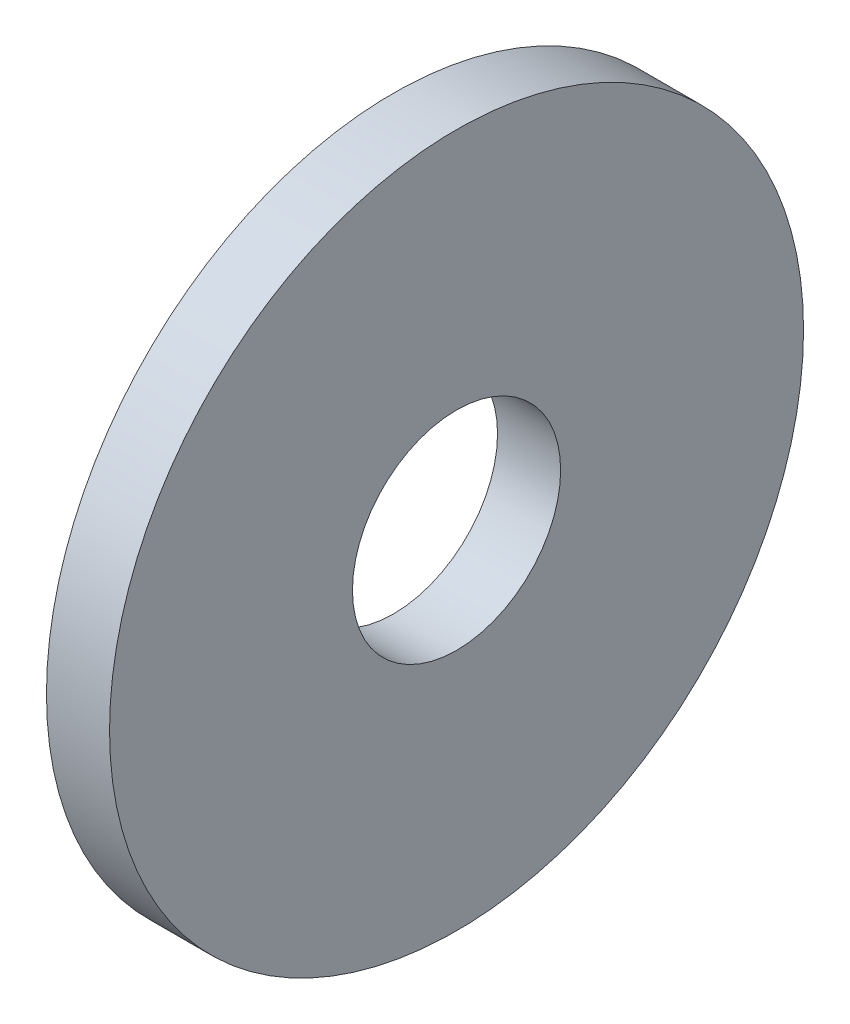
ISO-10303-21;
HEADER;
FILE_DESCRIPTION(('STEP AP214'),'2;1');
FILE_NAME('part.step','',(''),(''),'','','');
FILE_SCHEMA(('AUTOMOTIVE_DESIGN { 1 0 10303 214 1 1 1 1 }'));
ENDSEC;
DATA;
#1=APPLICATION_CONTEXT('core data for automotive mechanical design processes');
#2=APPLICATION_PROTOCOL_DEFINITION('international standard','automotive_design',2000,#1);
#3=PRODUCT_CONTEXT('',#1,'mechanical');
#4=PRODUCT('Part','Part','',(#3));
#5=PRODUCT_RELATED_PRODUCT_CATEGORY('part','',(#4));
#6=PRODUCT_DEFINITION_FORMATION('','',#4);
#7=PRODUCT_DEFINITION_CONTEXT('part definition',#1,'design');
#8=PRODUCT_DEFINITION('design','',#6,#7);
#9=PRODUCT_DEFINITION_SHAPE('','',#8);
#10=(LENGTH_UNIT() NAMED_UNIT(*) SI_UNIT(.MILLI.,.METRE.));
#11=(NAMED_UNIT(*) PLANE_ANGLE_UNIT() SI_UNIT($,.RADIAN.));
#12=(NAMED_UNIT(*) SI_UNIT($,.STERADIAN.) SOLID_ANGLE_UNIT());
#13=UNCERTAINTY_MEASURE_WITH_UNIT(LENGTH_MEASURE(1.E-05),#10,'distance_accuracy_value','');
#14=(GEOMETRIC_REPRESENTATION_CONTEXT(3) GLOBAL_UNCERTAINTY_ASSIGNED_CONTEXT((#13)) GLOBAL_UNIT_ASSIGNED_CONTEXT((#10,
#11,#12)) REPRESENTATION_CONTEXT('',''));
#15=CARTESIAN_POINT('',(0.,0.,0.));
#16=DIRECTION('',(0.,0.,1.));
#17=DIRECTION('',(1.,0.,0.));
#18=AXIS2_PLACEMENT_3D('',#15,#16,#17);
#19=CARTESIAN_POINT('',(-34.9249999999999,0.,0.));
#20=DIRECTION('',(-1.,0.,0.));
#21=DIRECTION('',(0.,0.,1.));
#22=AXIS2_PLACEMENT_3D('',#19,#20,#21);
#23=CYLINDRICAL_SURFACE('',#22,3.3);
#24=CARTESIAN_POINT('',(0.,0.,0.));
#25=DIRECTION('',(-1.,0.,0.));
#26=DIRECTION('',(0.,0.,1.));
#27=AXIS2_PLACEMENT_3D('',#24,#25,#26);
#28=CIRCLE('',#27,3.3);
#29=CARTESIAN_POINT('',(0.,0.,3.3));
#30=VERTEX_POINT('',#29);
#31=EDGE_CURVE('E10',#30,#30,#28,.T.);
#32=ORIENTED_EDGE('',*,*,#31,.F.);
#33=EDGE_LOOP('',(#32));
#34=FACE_BOUND('',#33,.T.);
#35=CARTESIAN_POINT('',(-2.,0.,0.));
#36=DIRECTION('',(-1.,0.,0.));
#37=DIRECTION('',(0.,0.,1.));
#38=AXIS2_PLACEMENT_3D('',#35,#36,#37);
#39=CIRCLE('',#38,3.3);
#40=CARTESIAN_POINT('',(-2.,0.,3.3));
#41=VERTEX_POINT('',#40);
#42=EDGE_CURVE('E46',#41,#41,#39,.T.);
#43=ORIENTED_EDGE('',*,*,#42,.T.);
#44=EDGE_LOOP('',(#43));
#45=FACE_BOUND('',#44,.T.);
#46=ADVANCED_FACE('F32',(#34,#45),#23,.F.);
#47=CARTESIAN_POINT('',(0.,3.3,0.));
#48=DIRECTION('',(-1.,0.,0.));
#49=DIRECTION('',(0.,0.,1.));
#50=AXIS2_PLACEMENT_3D('',#47,#48,#49);
#51=PLANE('',#50);
#52=CARTESIAN_POINT('',(0.,0.,0.));
#53=DIRECTION('',(-1.,0.,0.));
#54=DIRECTION('',(0.,0.,1.));
#55=AXIS2_PLACEMENT_3D('',#52,#53,#54);
#56=CIRCLE('',#55,11.);
#57=CARTESIAN_POINT('',(0.,0.,11.));
#58=VERTEX_POINT('',#57);
#59=EDGE_CURVE('E38',#58,#58,#56,.T.);
#60=ORIENTED_EDGE('',*,*,#59,.F.);
#61=EDGE_LOOP('',(#60));
#62=FACE_BOUND('',#61,.T.);
#63=ORIENTED_EDGE('',*,*,#31,.T.);
#64=EDGE_LOOP('',(#63));
#65=FACE_BOUND('',#64,.T.);
#66=ADVANCED_FACE('F61',(#62,#65),#51,.F.);
#67=CARTESIAN_POINT('',(-34.9249999999999,0.,0.));
#68=DIRECTION('',(-1.,0.,0.));
#69=DIRECTION('',(0.,0.,1.));
#70=AXIS2_PLACEMENT_3D('',#67,#68,#69);
#71=CYLINDRICAL_SURFACE('',#70,11.);
#72=CARTESIAN_POINT('',(-2.,0.,0.));
#73=DIRECTION('',(-1.,0.,0.));
#74=DIRECTION('',(0.,0.,1.));
#75=AXIS2_PLACEMENT_3D('',#72,#73,#74);
#76=CIRCLE('',#75,11.);
#77=CARTESIAN_POINT('',(-2.,0.,11.));
#78=VERTEX_POINT('',#77);
#79=EDGE_CURVE('E42',#78,#78,#76,.T.);
#80=ORIENTED_EDGE('',*,*,#79,.F.);
#81=EDGE_LOOP('',(#80));
#82=FACE_BOUND('',#81,.T.);
#83=ORIENTED_EDGE('',*,*,#59,.T.);
#84=EDGE_LOOP('',(#83));
#85=FACE_BOUND('',#84,.T.);
#86=ADVANCED_FACE('F56',(#82,#85),#71,.T.);
#87=CARTESIAN_POINT('',(-2.,11.,0.));
#88=DIRECTION('',(1.,0.,0.));
#89=DIRECTION('',(0.,0.,-1.));
#90=AXIS2_PLACEMENT_3D('',#87,#88,#89);
#91=PLANE('',#90);
#92=ORIENTED_EDGE('',*,*,#42,.F.);
#93=EDGE_LOOP('',(#92));
#94=FACE_BOUND('',#93,.T.);
#95=ORIENTED_EDGE('',*,*,#79,.T.);
#96=EDGE_LOOP('',(#95));
#97=FACE_BOUND('',#96,.T.);
#98=ADVANCED_FACE('F53',(#94,#97),#91,.F.);
#99=CLOSED_SHELL('',(#46,#66,#86,#98));
#100=MANIFOLD_SOLID_BREP('B2',#99);
#101=ADVANCED_BREP_SHAPE_REPRESENTATION('',(#18,#100),#14);
#102=SHAPE_DEFINITION_REPRESENTATION(#9,#101);
ENDSEC;
END-ISO-10303-21;
